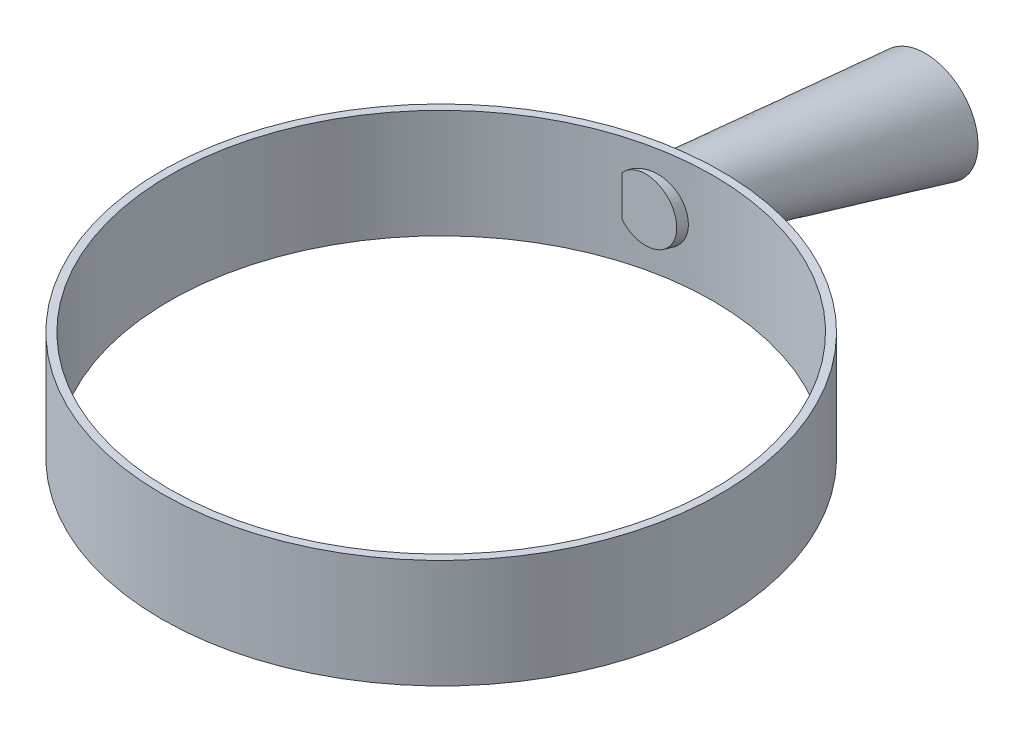
ISO-10303-21;
HEADER;
FILE_DESCRIPTION(('STEP AP214'),'2;1');
FILE_NAME('part.step','',(''),(''),'','','');
FILE_SCHEMA(('AUTOMOTIVE_DESIGN { 1 0 10303 214 1 1 1 1 }'));
ENDSEC;
DATA;
#1=APPLICATION_CONTEXT('core data for automotive mechanical design processes');
#2=APPLICATION_PROTOCOL_DEFINITION('international standard','automotive_design',2000,#1);
#3=PRODUCT_CONTEXT('',#1,'mechanical');
#4=PRODUCT('Part','Part','',(#3));
#5=PRODUCT_RELATED_PRODUCT_CATEGORY('part','',(#4));
#6=PRODUCT_DEFINITION_FORMATION('','',#4);
#7=PRODUCT_DEFINITION_CONTEXT('part definition',#1,'design');
#8=PRODUCT_DEFINITION('design','',#6,#7);
#9=PRODUCT_DEFINITION_SHAPE('','',#8);
#10=(LENGTH_UNIT() NAMED_UNIT(*) SI_UNIT(.MILLI.,.METRE.));
#11=(NAMED_UNIT(*) PLANE_ANGLE_UNIT() SI_UNIT($,.RADIAN.));
#12=(NAMED_UNIT(*) SI_UNIT($,.STERADIAN.) SOLID_ANGLE_UNIT());
#13=UNCERTAINTY_MEASURE_WITH_UNIT(LENGTH_MEASURE(1.E-05),#10,'distance_accuracy_value','');
#14=(GEOMETRIC_REPRESENTATION_CONTEXT(3) GLOBAL_UNCERTAINTY_ASSIGNED_CONTEXT((#13)) GLOBAL_UNIT_ASSIGNED_CONTEXT((#10,
#11,#12)) REPRESENTATION_CONTEXT('',''));
#15=CARTESIAN_POINT('',(0.,0.,0.));
#16=DIRECTION('',(0.,0.,1.));
#17=DIRECTION('',(1.,0.,0.));
#18=AXIS2_PLACEMENT_3D('',#15,#16,#17);
#19=CARTESIAN_POINT('',(3.57252169754929,6.99999999999999,34.7374626374517));
#20=DIRECTION('',(0.,-1.,0.));
#21=DIRECTION('',(0.,0.,-1.));
#22=AXIS2_PLACEMENT_3D('',#19,#20,#21);
#23=CYLINDRICAL_SURFACE('',#22,18.);
#24=CARTESIAN_POINT('',(-1.68130624389862,2.42674890075702,17.5212699119487));
#25=CARTESIAN_POINT('',(-1.64714885830323,2.37323130490346,17.5108460666581));
#26=CARTESIAN_POINT('',(-1.61082412494889,2.32120892872894,17.4998718462478));
#27=CARTESIAN_POINT('',(-1.53396896279211,2.2205876730403,17.4769481884529));
#28=CARTESIAN_POINT('',(-1.49343819140576,2.17198907293657,17.4649986716469));
#29=CARTESIAN_POINT('',(-1.40841455370007,2.07846941133044,17.4402885094069));
#30=CARTESIAN_POINT('',(-1.363915664429,2.03355414589842,17.4275266396534));
#31=CARTESIAN_POINT('',(-1.2714177505014,1.94770954326981,17.4014143158284));
#32=CARTESIAN_POINT('',(-1.22341864295314,1.90678030052333,17.3880638478208));
#33=CARTESIAN_POINT('',(-1.07452260671286,1.79049742615077,17.3473648983373));
#34=CARTESIAN_POINT('',(-0.968628461437852,1.72154017857043,17.3193398355642));
#35=CARTESIAN_POINT('',(-0.802210944996224,1.63289971273943,17.2770783945978));
#36=CARTESIAN_POINT('',(-0.745457329366602,1.60581281296106,17.2629496135019));
#37=CARTESIAN_POINT('',(-0.65867366229123,1.56903542455984,17.2418097170939));
#38=CARTESIAN_POINT('',(-0.629467715790664,1.55741764318894,17.2347713765564));
#39=CARTESIAN_POINT('',(-0.570545623672192,1.53553311410129,17.2207303151804));
#40=CARTESIAN_POINT('',(-0.54082944785951,1.52526644665557,17.213727596482));
#41=CARTESIAN_POINT('',(-0.452149839076636,1.49684836433202,17.1930717427487));
#42=CARTESIAN_POINT('',(-0.392541984678651,1.48060913104691,17.1794992794364));
#43=CARTESIAN_POINT('',(-0.272041676011762,1.45346353302474,17.152720845606));
#44=CARTESIAN_POINT('',(-0.211149074813771,1.4425577817337,17.1395149174108));
#45=CARTESIAN_POINT('',(-0.0885360876382672,1.42629362552735,17.1135986961763));
#46=CARTESIAN_POINT('',(-0.026815935774864,1.42093368389807,17.1008882667771));
#47=CARTESIAN_POINT('',(0.0969703841965522,1.41593902168373,17.0760774864612));
#48=CARTESIAN_POINT('',(0.159036457766588,1.41630280682861,17.0639769771428));
#49=CARTESIAN_POINT('',(0.27956489897628,1.42288678907074,17.041135644932));
#50=CARTESIAN_POINT('',(0.338037682896839,1.42878371416637,17.0303566429941));
#51=CARTESIAN_POINT('',(0.454344365341936,1.4458326180499,17.0095055754907));
#52=CARTESIAN_POINT('',(0.512178170647101,1.45698535350241,16.9994336119557));
#53=CARTESIAN_POINT('',(0.626739341035583,1.4843647187231,16.980048971343));
#54=CARTESIAN_POINT('',(0.683467078573145,1.50058960802744,16.9707360351918));
#55=CARTESIAN_POINT('',(0.795377455167991,1.53803058572239,16.9528996644549));
#56=CARTESIAN_POINT('',(0.850560193028975,1.55924635412356,16.9443761793025));
#57=CARTESIAN_POINT('',(0.956077109554433,1.60535193708865,16.9285627953396));
#58=CARTESIAN_POINT('',(1.00651404895767,1.62999235135715,16.9212317398182));
#59=CARTESIAN_POINT('',(1.10509935069146,1.68365957854962,16.9073110751165));
#60=CARTESIAN_POINT('',(1.1532481226807,1.71268560238379,16.9007213329254));
#61=CARTESIAN_POINT('',(1.24681126106863,1.77498525421269,16.8882805725098));
#62=CARTESIAN_POINT('',(1.29222591007791,1.80825844208927,16.8824294778668));
#63=CARTESIAN_POINT('',(1.38008002839797,1.87860458085108,16.8714289086351));
#64=CARTESIAN_POINT('',(1.42251900010307,1.91567816471516,16.8662795512587));
#65=CARTESIAN_POINT('',(1.5420235077123,2.02928071663711,16.8521798329568));
#66=CARTESIAN_POINT('',(1.61479581459061,2.11057755702023,16.8441208919161));
#67=CARTESIAN_POINT('',(1.71349770878025,2.240393913064,16.8336884901593));
#68=CARTESIAN_POINT('',(1.74466492780645,2.28499538135929,16.8304861689958));
#69=CARTESIAN_POINT('',(1.80321906614938,2.37666759201572,16.8246059928112));
#70=CARTESIAN_POINT('',(1.83060621798976,2.42373818224747,16.8219281055262));
#71=CARTESIAN_POINT('',(1.88212144755049,2.52142310083388,16.8169927955475));
#72=CARTESIAN_POINT('',(1.90613056346568,2.57210084451501,16.8147499865788));
#73=CARTESIAN_POINT('',(1.94988607821917,2.67526783518887,16.8107359200926));
#74=CARTESIAN_POINT('',(1.96963182613451,2.72775735738356,16.8089647345719));
#75=CARTESIAN_POINT('',(2.02235314647061,2.88744134952896,16.8043017622508));
#76=CARTESIAN_POINT('',(2.04884296834845,2.99690898712102,16.8020577771773));
#77=CARTESIAN_POINT('',(2.07527398321666,3.16432434043752,16.799839851642));
#78=CARTESIAN_POINT('',(2.08186278056905,3.22132322758641,16.7992924903098));
#79=CARTESIAN_POINT('',(2.09020516078843,3.33569812529338,16.7986008983645));
#80=CARTESIAN_POINT('',(2.09195858088284,3.39307414848175,16.7984566813226));
#81=CARTESIAN_POINT('',(2.09074059365874,3.50774967640152,16.7985573288503));
#82=CARTESIAN_POINT('',(2.08777071008301,3.56504919984406,16.7988020679424));
#83=CARTESIAN_POINT('',(2.07709975455174,3.67922736918948,16.7996884717982));
#84=CARTESIAN_POINT('',(2.0693968265188,3.73610584111556,16.8003302922792));
#85=CARTESIAN_POINT('',(2.04924710674694,3.849649597947,16.8020301689834));
#86=CARTESIAN_POINT('',(2.03674945701169,3.90630578070794,16.8030926916412));
#87=CARTESIAN_POINT('',(2.00713095228749,4.01838679455808,16.8056536937092));
#88=CARTESIAN_POINT('',(1.99000992528076,4.07381157974874,16.8071521893405));
#89=CARTESIAN_POINT('',(1.95132494278443,4.18308056801923,16.8106085061657));
#90=CARTESIAN_POINT('',(1.92976054146425,4.2369246118739,16.8125663734539));
#91=CARTESIAN_POINT('',(1.88224674392067,4.34262306670363,16.8169844396471));
#92=CARTESIAN_POINT('',(1.85629733390069,4.39447747141803,16.8194446401327));
#93=CARTESIAN_POINT('',(1.7997126123435,4.49679837157987,16.8249539040612));
#94=CARTESIAN_POINT('',(1.76899879654235,4.54722082299186,16.8280131125359));
#95=CARTESIAN_POINT('',(1.70362537947908,4.64539819240656,16.8347167939011));
#96=CARTESIAN_POINT('',(1.6689657237342,4.69315307356285,16.8383612748732));
#97=CARTESIAN_POINT('',(1.59582653345379,4.78559850204911,16.8462908646327));
#98=CARTESIAN_POINT('',(1.55734662367943,4.83028874762942,16.850576036372));
#99=CARTESIAN_POINT('',(1.47684997140539,4.91628098381675,16.8598285707323));
#100=CARTESIAN_POINT('',(1.43483318329212,4.9575829307128,16.8647959421519));
#101=CARTESIAN_POINT('',(1.34688758131266,5.03732215734274,16.8755324234918));
#102=CARTESIAN_POINT('',(1.3009028045668,5.07569600067237,16.8813141378868));
#103=CARTESIAN_POINT('',(1.2059873990508,5.14847170528105,16.8936456612186));
#104=CARTESIAN_POINT('',(1.15705679022609,5.18287359344849,16.9001954649552));
#105=CARTESIAN_POINT('',(1.0565887978769,5.24748983232681,16.9140888220268));
#106=CARTESIAN_POINT('',(1.00505059137842,5.27770284960897,16.9214326267954));
#107=CARTESIAN_POINT('',(0.899767648813964,5.33370314525893,16.9369229041325));
#108=CARTESIAN_POINT('',(0.846023800423554,5.3594921828562,16.9450690556037));
#109=CARTESIAN_POINT('',(0.735824065623823,5.40692112052856,16.9623027988182));
#110=CARTESIAN_POINT('',(0.679338362421781,5.42848710672627,16.9714034944707));
#111=CARTESIAN_POINT('',(0.564859415738477,5.46668651777688,16.9904253087499));
#112=CARTESIAN_POINT('',(0.506866157095086,5.48331989299951,17.0003464356302));
#113=CARTESIAN_POINT('',(0.389831828798211,5.51168645901409,17.0209728217183));
#114=CARTESIAN_POINT('',(0.330790850096673,5.52342007300299,17.0316780131117));
#115=CARTESIAN_POINT('',(0.212092809358189,5.54191889353352,17.0538210609087));
#116=CARTESIAN_POINT('',(0.152435699071587,5.5486837079274,17.0652589750628));
#117=CARTESIAN_POINT('',(-0.0279473463279444,5.56146925495157,17.1008071843124));
#118=CARTESIAN_POINT('',(-0.149170060241136,5.55975875401986,17.125991431408));
#119=CARTESIAN_POINT('',(-0.32880653041724,5.54093725298148,17.1652273240119));
#120=CARTESIAN_POINT('',(-0.388356370960633,5.53194319239681,17.1785581789525));
#121=CARTESIAN_POINT('',(-0.506354080890366,5.50879712547604,17.2055939769117));
#122=CARTESIAN_POINT('',(-0.564802319223292,5.49464687952667,17.2192987907803));
#123=CARTESIAN_POINT('',(-0.678889047192573,5.46170524760306,17.2466400569498));
#124=CARTESIAN_POINT('',(-0.734561163617617,5.44302535918531,17.2602711188429));
#125=CARTESIAN_POINT('',(-0.844062570659282,5.40093485832914,17.2876211899332));
#126=CARTESIAN_POINT('',(-0.897892053572942,5.37752474130781,17.3013401897746));
#127=CARTESIAN_POINT('',(-1.00326699464413,5.3260008771879,17.3286970618438));
#128=CARTESIAN_POINT('',(-1.05481292370574,5.2978881056139,17.3423349502912));
#129=CARTESIAN_POINT('',(-1.15507601371514,5.23688539017305,17.3693160101023));
#130=CARTESIAN_POINT('',(-1.20379355561727,5.20399609175394,17.3826592210052));
#131=CARTESIAN_POINT('',(-1.29628843202203,5.13501454837057,17.4083856566618));
#132=CARTESIAN_POINT('',(-1.34018119523676,5.09908308884675,17.4207861442621));
#133=CARTESIAN_POINT('',(-1.42474265531188,5.02341311322201,17.4449994534919));
#134=CARTESIAN_POINT('',(-1.46541070369258,4.98367383491154,17.4568121567428));
#135=CARTESIAN_POINT('',(-1.54321931172166,4.90068990540256,17.479686456361));
#136=CARTESIAN_POINT('',(-1.58036031148224,4.85744569280824,17.4907481463918));
#137=CARTESIAN_POINT('',(-1.6508055453298,4.76773777550706,17.5119523443931));
#138=CARTESIAN_POINT('',(-1.68411060533513,4.72127476730413,17.5220950501298));
#139=CARTESIAN_POINT('',(-1.74539367458474,4.62703905188041,17.5409290456739));
#140=CARTESIAN_POINT('',(-1.77351722375938,4.57936893673991,17.5496586834554));
#141=CARTESIAN_POINT('',(-1.82544304362026,4.48153340742196,17.5658954484764));
#142=CARTESIAN_POINT('',(-1.84924527443019,4.43136797022357,17.5734025644346));
#143=CARTESIAN_POINT('',(-1.89250180058825,4.32905165990366,17.5871264129957));
#144=CARTESIAN_POINT('',(-1.91195798293046,4.27690166000783,17.5933437055383));
#145=CARTESIAN_POINT('',(-1.94642745120453,4.17102969096096,17.6044090780259));
#146=CARTESIAN_POINT('',(-1.96144033275987,4.11730757922354,17.6092570333483));
#147=CARTESIAN_POINT('',(-1.99845494479587,3.95994913140906,17.6212451425338));
#148=CARTESIAN_POINT('',(-2.01467041461782,3.85470858418883,17.6265484750324));
#149=CARTESIAN_POINT('',(-2.02641911981274,3.69598367802394,17.6303920798481));
#150=CARTESIAN_POINT('',(-2.0282381745066,3.64291426441289,17.630987581664));
#151=CARTESIAN_POINT('',(-2.02783343560043,3.53675290088268,17.6308550690471));
#152=CARTESIAN_POINT('',(-2.0256064781445,3.48366096581183,17.6301260188558));
#153=CARTESIAN_POINT('',(-2.01263780475829,3.32170143002434,17.6258844567646));
#154=CARTESIAN_POINT('',(-1.99537602167503,3.2133153893717,17.6202417350621));
#155=CARTESIAN_POINT('',(-1.95754794631821,3.05400905255806,17.6080000525931));
#156=CARTESIAN_POINT('',(-1.94293299651594,3.00141193521884,17.6032846432082));
#157=CARTESIAN_POINT('',(-1.90992197246009,2.8975394859749,17.5926932795088));
#158=CARTESIAN_POINT('',(-1.89152700393327,2.84626377245983,17.586817664596));
#159=CARTESIAN_POINT('',(-1.84540180942308,2.73126197821691,17.5721825059902));
#160=CARTESIAN_POINT('',(-1.81649858812428,2.66804762567927,17.5630755647001));
#161=CARTESIAN_POINT('',(-1.75301610341262,2.54488466280988,17.5432849304263));
#162=CARTESIAN_POINT('',(-1.71844207492044,2.48493310782289,17.5326026925631));
#163=CARTESIAN_POINT('',(-1.68130624389862,2.42674890075702,17.5212699119487));
#164=B_SPLINE_CURVE_WITH_KNOTS('',3,(#24,#25,#26,#27,#28,#29,#30,#31,#32,#33,#34,#35,#36,#37,
#38,#39,#40,#41,#42,#43,#44,#45,#46,#47,#48,#49,#50,#51,#52,#53,#54,#55,#56,#57,#58,#59,#60,#61,
#62,#63,#64,#65,#66,#67,#68,#69,#70,#71,#72,#73,#74,#75,#76,#77,#78,#79,#80,#81,#82,#83,#84,#85,
#86,#87,#88,#89,#90,#91,#92,#93,#94,#95,#96,#97,#98,#99,#100,#101,#102,#103,#104,#105,#106,#107,
#108,#109,#110,#111,#112,#113,#114,#115,#116,#117,#118,#119,#120,#121,#122,#123,#124,#125,#126,
#127,#128,#129,#130,#131,#132,#133,#134,#135,#136,#137,#138,#139,#140,#141,#142,#143,#144,#145,
#146,#147,#148,#149,#150,#151,#152,#153,#154,#155,#156,#157,#158,#159,#160,#161,#162,#163),
.UNSPECIFIED.,.T.,.F.,(4,2,2,2,2,2,2,2,2,2,2,2,2,2,2,2,2,2,2,2,2,2,2,2,2,2,2,2,2,2,2,2,2,2,2,2,
2,2,2,2,2,2,2,2,2,2,2,2,2,2,2,2,2,2,2,2,2,2,2,2,2,2,2,2,2,2,2,2,2,4),(0.,0.192949459601889,
0.385914647387855,0.579177879032076,0.772445688998599,1.15853847866776,1.35170227386665,
1.44830036342129,1.54490418937699,1.73440900248951,1.92393560692829,2.11340968049007,
2.30283428964733,2.48183833205526,2.6608681530613,2.83983660890551,3.01879359334054,
3.18841493410777,3.35800579167097,3.52757908939696,3.69718067660885,4.0237060617345,
4.18708659909309,4.35045708192478,4.51861295406788,4.68679448180453,5.02296414097425,
5.19495252088931,5.36694669035218,5.53888538556718,5.71089155012149,5.88477502774113,
6.05866497577673,6.23257237974491,6.40648033088949,6.58363812141011,6.76079835835894,
6.93797601385942,7.11515595469288,7.29546347164812,7.47576976792836,7.65613332934691,
7.83642500070823,8.01963485697423,8.20284655657339,8.38604242873265,8.56925275752897,
8.93850646628429,9.12336931840989,9.30816911507026,9.48881412569029,9.66944022638242,
9.85002890412893,10.0305932017571,10.2045649331565,10.3785715614456,10.5525564482291,
10.7265038039212,10.8943692793278,11.0622363036873,11.2300303002221,11.3978395626835,
11.715969581005,11.87513635077,12.0344276375819,12.3624263656116,12.5266867856866,
12.6908992247159,12.900866181286,13.1106403897808),.UNSPECIFIED.);
#165=CARTESIAN_POINT('',(-1.68130624389862,2.42674890075702,17.5212699119487));
#166=VERTEX_POINT('',#165);
#167=EDGE_CURVE('E90',#166,#166,#164,.T.);
#168=ORIENTED_EDGE('',*,*,#167,.T.);
#169=EDGE_LOOP('',(#168));
#170=FACE_BOUND('',#169,.T.);
#171=CARTESIAN_POINT('',(3.57252169754929,6.99999999999999,34.7374626374517));
#172=DIRECTION('',(0.,1.,0.));
#173=DIRECTION('',(0.,0.,1.));
#174=AXIS2_PLACEMENT_3D('',#171,#172,#173);
#175=CIRCLE('',#174,18.);
#176=CARTESIAN_POINT('',(3.57252169754929,6.99999999999999,52.7374626374517));
#177=VERTEX_POINT('',#176);
#178=EDGE_CURVE('E69',#177,#177,#175,.T.);
#179=ORIENTED_EDGE('',*,*,#178,.F.);
#180=EDGE_LOOP('',(#179));
#181=FACE_BOUND('',#180,.T.);
#182=CARTESIAN_POINT('',(3.57252169754929,0.,34.7374626374517));
#183=DIRECTION('',(0.,1.,0.));
#184=DIRECTION('',(0.,0.,1.));
#185=AXIS2_PLACEMENT_3D('',#182,#183,#184);
#186=CIRCLE('',#185,18.);
#187=CARTESIAN_POINT('',(3.57252169754929,0.,52.7374626374517));
#188=VERTEX_POINT('',#187);
#189=EDGE_CURVE('E92',#188,#188,#186,.T.);
#190=ORIENTED_EDGE('',*,*,#189,.T.);
#191=EDGE_LOOP('',(#190));
#192=FACE_BOUND('',#191,.T.);
#193=ADVANCED_FACE('F47',(#170,#181,#192),#23,.T.);
#194=CARTESIAN_POINT('',(3.57252169754929,6.99999999999999,34.7374626374517));
#195=DIRECTION('',(0.,1.,0.));
#196=DIRECTION('',(0.,0.,1.));
#197=AXIS2_PLACEMENT_3D('',#194,#195,#196);
#198=PLANE('',#197);
#199=CARTESIAN_POINT('',(3.57252169754929,6.99999999999999,34.7374626374517));
#200=DIRECTION('',(0.,1.,0.));
#201=DIRECTION('',(0.,0.,1.));
#202=AXIS2_PLACEMENT_3D('',#199,#200,#201);
#203=CIRCLE('',#202,17.5);
#204=CARTESIAN_POINT('',(3.57252169754929,6.99999999999999,52.2374626374517));
#205=VERTEX_POINT('',#204);
#206=EDGE_CURVE('E85',#205,#205,#203,.T.);
#207=ORIENTED_EDGE('',*,*,#206,.F.);
#208=EDGE_LOOP('',(#207));
#209=FACE_BOUND('',#208,.T.);
#210=ORIENTED_EDGE('',*,*,#178,.T.);
#211=EDGE_LOOP('',(#210));
#212=FACE_BOUND('',#211,.T.);
#213=ADVANCED_FACE('F170',(#209,#212),#198,.T.);
#214=CARTESIAN_POINT('',(3.57252169754929,0.,34.7374626374517));
#215=DIRECTION('',(0.,1.,0.));
#216=DIRECTION('',(0.,0.,1.));
#217=AXIS2_PLACEMENT_3D('',#214,#215,#216);
#218=PLANE('',#217);
#219=CARTESIAN_POINT('',(3.57252169754929,0.,34.7374626374517));
#220=DIRECTION('',(0.,-1.,0.));
#221=DIRECTION('',(0.,0.,-1.));
#222=AXIS2_PLACEMENT_3D('',#219,#220,#221);
#223=CIRCLE('',#222,17.5);
#224=CARTESIAN_POINT('',(3.57252169754929,0.,17.2374626374517));
#225=VERTEX_POINT('',#224);
#226=EDGE_CURVE('E88',#225,#225,#223,.T.);
#227=ORIENTED_EDGE('',*,*,#226,.F.);
#228=EDGE_LOOP('',(#227));
#229=FACE_BOUND('',#228,.T.);
#230=ORIENTED_EDGE('',*,*,#189,.F.);
#231=EDGE_LOOP('',(#230));
#232=FACE_BOUND('',#231,.T.);
#233=ADVANCED_FACE('F80',(#229,#232),#218,.F.);
#234=CARTESIAN_POINT('',(3.57252169754929,17.,34.7374626374517));
#235=DIRECTION('',(0.,-1.,0.));
#236=DIRECTION('',(0.,0.,-1.));
#237=AXIS2_PLACEMENT_3D('',#234,#235,#236);
#238=CYLINDRICAL_SURFACE('',#237,17.5);
#239=CARTESIAN_POINT('',(-1.53701296422848,4.95175351119825,18.));
#240=CARTESIAN_POINT('',(-1.50153502644045,4.99342665133516,17.9891689839598));
#241=CARTESIAN_POINT('',(-1.46433121425551,5.03352559656854,17.977935283513));
#242=CARTESIAN_POINT('',(-1.38672198991224,5.11029270737214,17.9548068064542));
#243=CARTESIAN_POINT('',(-1.34631636358678,5.14696064308613,17.9429119856363));
#244=CARTESIAN_POINT('',(-1.26268111558752,5.21647575600409,17.9186426366942));
#245=CARTESIAN_POINT('',(-1.21946011017455,5.249333807439,17.9062696153444));
#246=CARTESIAN_POINT('',(-1.13031871891712,5.31097780366795,17.8811453485749));
#247=CARTESIAN_POINT('',(-1.0843987399676,5.33976436005943,17.8683941603102));
#248=CARTESIAN_POINT('',(-0.990332277925075,5.39318317284197,17.8427078746898));
#249=CARTESIAN_POINT('',(-0.942188339703415,5.41782003467456,17.8297729987222));
#250=CARTESIAN_POINT('',(-0.844028317996039,5.4630237351677,17.8038669301575));
#251=CARTESIAN_POINT('',(-0.794011860080122,5.48358975459516,17.790895730782));
#252=CARTESIAN_POINT('',(-0.692431385387396,5.52063513963843,17.7650460927486));
#253=CARTESIAN_POINT('',(-0.640866490952668,5.53711213663255,17.7521677120311));
#254=CARTESIAN_POINT('',(-0.536541866172644,5.5659000669202,17.7266284180388));
#255=CARTESIAN_POINT('',(-0.48378227022058,5.57821146634666,17.7139674805826));
#256=CARTESIAN_POINT('',(-0.374328409722634,5.59912090279515,17.6882482692312));
#257=CARTESIAN_POINT('',(-0.317581239113693,5.60746739135196,17.6752084594643));
#258=CARTESIAN_POINT('',(-0.20346815198762,5.61911559426997,17.6495920514792));
#259=CARTESIAN_POINT('',(-0.146102202933554,5.62241704203507,17.6370154777742));
#260=CARTESIAN_POINT('',(-0.0311759434767913,5.62418040564215,17.6124279562121));
#261=CARTESIAN_POINT('',(0.0263843616939886,5.62264245073587,17.6004169932572));
#262=CARTESIAN_POINT('',(0.141291621661019,5.61480173662587,17.5770398035803));
#263=CARTESIAN_POINT('',(0.198638557938321,5.60849857310193,17.5656736316558));
#264=CARTESIAN_POINT('',(0.370946646917059,5.58242711692876,17.5324169439395));
#265=CARTESIAN_POINT('',(0.48516050208567,5.55548378028541,17.511584976263));
#266=CARTESIAN_POINT('',(0.652096933436513,5.5009484965445,17.4827718245402));
#267=CARTESIAN_POINT('',(0.707033033513427,5.48040551103294,17.4735700094738));
#268=CARTESIAN_POINT('',(0.815158173184163,5.43480881780919,17.4559715902325));
#269=CARTESIAN_POINT('',(0.868347121403549,5.40975487462078,17.4475750281277));
#270=CARTESIAN_POINT('',(0.973479215866983,5.35478021254759,17.4314561278525));
#271=CARTESIAN_POINT('',(1.02538350317421,5.32478101704462,17.4237483989096));
#272=CARTESIAN_POINT('',(1.12656665292769,5.26045820203752,17.4091645223863));
#273=CARTESIAN_POINT('',(1.17584542249936,5.22613442970092,17.4022884042123));
#274=CARTESIAN_POINT('',(1.27140506723224,5.15339922263624,17.3893449015231));
#275=CARTESIAN_POINT('',(1.31768572743686,5.11498749533316,17.3832775749633));
#276=CARTESIAN_POINT('',(1.4069131741757,5.03436804334384,17.3719174232846));
#277=CARTESIAN_POINT('',(1.44986021192352,4.99216060521145,17.3666245397789));
#278=CARTESIAN_POINT('',(1.53164855467611,4.90450201941141,17.3568262415996));
#279=CARTESIAN_POINT('',(1.57052060031465,4.85908026351775,17.3523147335292));
#280=CARTESIAN_POINT('',(1.6442830742315,4.76505223419808,17.3439789446348));
#281=CARTESIAN_POINT('',(1.67917321044634,4.71644572758934,17.3401547142092));
#282=CARTESIAN_POINT('',(1.74479726093446,4.6164624498925,17.3331381809238));
#283=CARTESIAN_POINT('',(1.77553143242497,4.56508585052404,17.3299458389502));
#284=CARTESIAN_POINT('',(1.83242955340899,4.45982984544839,17.3241660042741));
#285=CARTESIAN_POINT('',(1.85859393732016,4.40595067825991,17.3215784540705));
#286=CARTESIAN_POINT('',(1.90569238509967,4.29716935006733,17.3170082961106));
#287=CARTESIAN_POINT('',(1.92671777187905,4.24230709330341,17.3150149619971));
#288=CARTESIAN_POINT('',(1.96410496368317,4.1309986618195,17.3115237231266));
#289=CARTESIAN_POINT('',(1.98046653930682,4.07455240933673,17.3100258427391));
#290=CARTESIAN_POINT('',(2.0083181389311,3.96045494315283,17.3075037906087));
#291=CARTESIAN_POINT('',(2.0198084442427,3.90280379923479,17.3064795915109));
#292=CARTESIAN_POINT('',(2.03780466774715,3.78674828165502,17.3048862803413));
#293=CARTESIAN_POINT('',(2.04431074224387,3.728343931672,17.3043171539988));
#294=CARTESIAN_POINT('',(2.05612500491744,3.55416402113645,17.3032820213243));
#295=CARTESIAN_POINT('',(2.05413337968024,3.43775704848366,17.3034529561172));
#296=CARTESIAN_POINT('',(2.03614353549111,3.26491055657633,17.3050344502488));
#297=CARTESIAN_POINT('',(2.02763827111792,3.20755998298179,17.3057831908938));
#298=CARTESIAN_POINT('',(2.00580317075822,3.09379730469184,17.3077317097702));
#299=CARTESIAN_POINT('',(1.99247539956463,3.03738480914701,17.3089312949775));
#300=CARTESIAN_POINT('',(1.96132905479054,2.92689915704265,17.3117834139792));
#301=CARTESIAN_POINT('',(1.94359344436421,2.87280231704792,17.3134276245994));
#302=CARTESIAN_POINT('',(1.90359446808634,2.76633206188147,17.3172133382559));
#303=CARTESIAN_POINT('',(1.88133173693005,2.7139584063165,17.3193547715883));
#304=CARTESIAN_POINT('',(1.83234165781146,2.61135439207036,17.3241809255101));
#305=CARTESIAN_POINT('',(1.80561373998109,2.56112430799041,17.3268657154544));
#306=CARTESIAN_POINT('',(1.74777730888777,2.4632896193861,17.332832525));
#307=CARTESIAN_POINT('',(1.71666868286036,2.41568508249024,17.3361145599757));
#308=CARTESIAN_POINT('',(1.65157718757039,2.3248348347648,17.3431816576253));
#309=CARTESIAN_POINT('',(1.61771859673533,2.28149826835384,17.346947197044));
#310=CARTESIAN_POINT('',(1.5465730935814,2.19779107140663,17.3550918607632));
#311=CARTESIAN_POINT('',(1.50928591678931,2.1574206701064,17.3594710324116));
#312=CARTESIAN_POINT('',(1.43154449121838,2.07996280184749,17.368877531113));
#313=CARTESIAN_POINT('',(1.39109134989119,2.04287419650634,17.3739046319154));
#314=CARTESIAN_POINT('',(1.30725191901662,1.97229545730366,17.3846432687746));
#315=CARTESIAN_POINT('',(1.26386617195371,1.93880466085766,17.3903546783954));
#316=CARTESIAN_POINT('',(1.17435703245503,1.8758221251874,17.4025025542049));
#317=CARTESIAN_POINT('',(1.12823322472939,1.84633099484402,17.4089391305153));
#318=CARTESIAN_POINT('',(1.03365573705458,1.79159319560649,17.4225427257498));
#319=CARTESIAN_POINT('',(0.985201810862873,1.76634697657981,17.4297098219638));
#320=CARTESIAN_POINT('',(0.836996650033497,1.6969651036072,17.4523007135384));
#321=CARTESIAN_POINT('',(0.7343397780681,1.65914308241068,17.4688224058396));
#322=CARTESIAN_POINT('',(0.578270057538655,1.61585471839914,17.4954440027915));
#323=CARTESIAN_POINT('',(0.526402237334347,1.6037198381259,17.504529546148));
#324=CARTESIAN_POINT('',(0.421943896793011,1.58373427068747,17.5233212076932));
#325=CARTESIAN_POINT('',(0.369353505290923,1.57588282968923,17.5330272163514));
#326=CARTESIAN_POINT('',(0.263818529712404,1.56468738456564,17.5530113160363));
#327=CARTESIAN_POINT('',(0.210874038767152,1.56134223873782,17.5632892614712));
#328=CARTESIAN_POINT('',(0.104998200979326,1.55903965106703,17.5843520933088));
#329=CARTESIAN_POINT('',(0.0520668567973784,1.56008278896071,17.5951370465062));
#330=CARTESIAN_POINT('',(-0.109088761771805,1.56973558999044,17.6287527056086));
#331=CARTESIAN_POINT('',(-0.216815921464685,1.58515901191339,17.6523034737337));
#332=CARTESIAN_POINT('',(-0.42827200947336,1.63274033526699,17.70057828177));
#333=CARTESIAN_POINT('',(-0.531998578465639,1.66490795416956,17.7253029953985));
#334=CARTESIAN_POINT('',(-0.686335287861645,1.72656539300943,17.7635048324791));
#335=CARTESIAN_POINT('',(-0.739293392960327,1.7503934981506,17.7768868875606));
#336=CARTESIAN_POINT('',(-0.84309077616215,1.80234233263864,17.8036139474708));
#337=CARTESIAN_POINT('',(-0.893929749109009,1.83046367751468,17.8169589467071));
#338=CARTESIAN_POINT('',(-0.993143326298266,1.8907977421927,17.8434594995973));
#339=CARTESIAN_POINT('',(-1.0415186563308,1.92300924714842,17.8566151082169));
#340=CARTESIAN_POINT('',(-1.13556087949751,1.9912708973032,17.8826017250076));
#341=CARTESIAN_POINT('',(-1.18122837757437,2.02732018005529,17.8954328053097));
#342=CARTESIAN_POINT('',(-1.25406869256965,2.08970867935134,17.9161988741604));
#343=CARTESIAN_POINT('',(-1.28210087076011,2.11500793657427,17.9242697734538));
#344=CARTESIAN_POINT('',(-1.33686499037321,2.16703536977008,17.940179110215));
#345=CARTESIAN_POINT('',(-1.36359720330078,2.19376324489908,17.948017596089));
#346=CARTESIAN_POINT('',(-1.44161876622835,2.27592130579918,17.9710873805959));
#347=CARTESIAN_POINT('',(-1.49085347267477,2.33342898668168,17.9859075161126));
#348=CARTESIAN_POINT('',(-1.53701296422848,2.39354749130152,18.));
#349=B_SPLINE_CURVE_WITH_KNOTS('',3,(#239,#240,#241,#242,#243,#244,#245,#246,#247,#248,#249,
#250,#251,#252,#253,#254,#255,#256,#257,#258,#259,#260,#261,#262,#263,#264,#265,#266,#267,#268,
#269,#270,#271,#272,#273,#274,#275,#276,#277,#278,#279,#280,#281,#282,#283,#284,#285,#286,#287,
#288,#289,#290,#291,#292,#293,#294,#295,#296,#297,#298,#299,#300,#301,#302,#303,#304,#305,#306,
#307,#308,#309,#310,#311,#312,#313,#314,#315,#316,#317,#318,#319,#320,#321,#322,#323,#324,#325,
#326,#327,#328,#329,#330,#331,#332,#333,#334,#335,#336,#337,#338,#339,#340,#341,#342,#343,#344,
#345,#346,#347,#348),.UNSPECIFIED.,.F.,.F.,(4,2,2,2,2,2,2,2,2,2,2,2,2,2,2,2,2,2,2,2,2,2,2,2,2,2,
2,2,2,2,2,2,2,2,2,2,2,2,2,2,2,2,2,2,2,2,2,2,2,2,2,2,2,2,4),(0.,0.167322649943499,
0.334656501446298,0.501500333955722,0.668319077429773,0.834951443372289,1.00161730908144,
1.16837949407865,1.33512301210889,1.51136723046049,1.6876207617985,1.86386958576207,
2.04013336583108,2.39573993723148,2.57368734010761,2.75164403469978,2.93275878536394,
3.11387993849963,3.29501406320713,3.47613452481362,3.65577185459069,3.83542235187726,
4.01506172530324,4.19468401236809,4.37083432333384,4.54699329719385,4.7231420966636,
4.89928537193734,5.24649524309157,5.4202792095352,5.59398885692766,5.76464833813174,
5.93528390961879,6.10594127507757,6.27660303425592,6.44178793203754,6.60698558250847,
6.77212570306813,6.93723535854732,7.10237012100613,7.26752237311075,7.59760112869832,
7.75958745917141,7.92154527282338,8.08346204557017,8.2454002098315,8.57794517141013,
8.91068334053071,9.0892926229914,9.26792753706265,9.44650951713029,9.62505144963052,
9.74084642917303,9.85661711950072,10.087674308613),.UNSPECIFIED.);
#350=CARTESIAN_POINT('',(-1.5370130912736,4.95257404532555,18.));
#351=VERTEX_POINT('',#350);
#352=CARTESIAN_POINT('',(-1.53701295651375,2.39349054549986,18.));
#353=VERTEX_POINT('',#352);
#354=EDGE_CURVE('E57',#351,#353,#349,.T.);
#355=ORIENTED_EDGE('',*,*,#354,.T.);
#356=DIRECTION('',(0.,-1.,0.));
#357=VECTOR('',#356,1.);
#358=CARTESIAN_POINT('',(-1.53701296422847,17.,18.));
#359=LINE('',#358,#357);
#360=EDGE_CURVE('E12',#353,#351,#359,.F.);
#361=ORIENTED_EDGE('',*,*,#360,.T.);
#362=EDGE_LOOP('',(#355,#361));
#363=FACE_BOUND('',#362,.T.);
#364=ORIENTED_EDGE('',*,*,#206,.T.);
#365=EDGE_LOOP('',(#364));
#366=FACE_BOUND('',#365,.T.);
#367=ORIENTED_EDGE('',*,*,#226,.T.);
#368=EDGE_LOOP('',(#367));
#369=FACE_BOUND('',#368,.T.);
#370=ADVANCED_FACE('F77',(#363,#366,#369),#238,.F.);
#371=CARTESIAN_POINT('',(-1.64420859163813,2.53470814963623,18.));
#372=CARTESIAN_POINT('',(-3.0390608421143,-1.52450293470611,0.));
#373=CARTESIAN_POINT('',(-1.739098078059,2.67172553227274,18.));
#374=CARTESIAN_POINT('',(-3.16610275333981,-1.27124786452992,0.));
#375=CARTESIAN_POINT('',(-1.8297757513697,2.83825815705994,18.));
#376=CARTESIAN_POINT('',(-3.27901674678468,-0.969317432741587,0.));
#377=CARTESIAN_POINT('',(-1.9647620933238,3.24300886049392,18.));
#378=CARTESIAN_POINT('',(-3.4097017135102,-0.255854130310134,0.));
#379=CARTESIAN_POINT('',(-2.00864932025314,3.48249191529044,18.));
#380=CARTESIAN_POINT('',(-3.42646165551559,0.157707432901679,0.));
#381=CARTESIAN_POINT('',(-1.99353210318465,3.8822061503986,18.));
#382=CARTESIAN_POINT('',(-3.30569482401485,0.826897519804699,0.));
#383=CARTESIAN_POINT('',(-1.97438310865278,4.02229764428088,18.));
#384=CARTESIAN_POINT('',(-3.24093330256126,1.05738110241765,0.));
#385=CARTESIAN_POINT('',(-1.90272521360294,4.30560502143944,18.));
#386=CARTESIAN_POINT('',(-3.05283606265305,1.517199868826,0.));
#387=CARTESIAN_POINT('',(-1.85021631308498,4.44882090471571,18.));
#388=CARTESIAN_POINT('',(-2.92934385841876,1.74644085793232,0.));
#389=CARTESIAN_POINT('',(-1.7066985444283,4.72779461903048,18.));
#390=CARTESIAN_POINT('',(-2.62124799540547,2.18178139548716,0.));
#391=CARTESIAN_POINT('',(-1.61526133782003,4.86267057993299,18.));
#392=CARTESIAN_POINT('',(-2.43656717615997,2.38766980318154,0.));
#393=CARTESIAN_POINT('',(-1.3997576754494,5.11012381636975,18.));
#394=CARTESIAN_POINT('',(-2.01477615800353,2.75290823060009,0.));
#395=CARTESIAN_POINT('',(-1.27569121968704,5.22270109190401,18.));
#396=CARTESIAN_POINT('',(-1.7777580048823,2.91201893088879,0.));
#397=CARTESIAN_POINT('',(-1.00165645441402,5.41248006474577,18.));
#398=CARTESIAN_POINT('',(-1.27124786452992,3.16610275333981,0.));
#399=CARTESIAN_POINT('',(-0.852636362084233,5.48902508740675,18.));
#400=CARTESIAN_POINT('',(-1.00199564541254,3.26095559913647,0.));
#401=CARTESIAN_POINT('',(-0.545198249202024,5.60372791852095,18.));
#402=CARTESIAN_POINT('',(-0.457041628823034,3.3806714780481,0.));
#403=CARTESIAN_POINT('',(-0.386780228649601,5.64188572697416,18.));
#404=CARTESIAN_POINT('',(-0.18158669654555,3.40560382057995,0.));
#405=CARTESIAN_POINT('',(-0.0751537504860395,5.67811584298479,18.));
#406=CARTESIAN_POINT('',(0.351579957289405,3.39227101581573,0.));
#407=CARTESIAN_POINT('',(0.0773798321885172,5.67689928527011,18.));
#408=CARTESIAN_POINT('',(0.60916857001661,3.35419395991116,0.));
#409=CARTESIAN_POINT('',(0.367789185484185,5.64433655513542,18.));
#410=CARTESIAN_POINT('',(1.09020838923408,3.230038565628,0.));
#411=CARTESIAN_POINT('',(0.505664956105295,5.61299038271541,18.));
#412=CARTESIAN_POINT('',(1.31367765599887,3.14414198055798,0.));
#413=CARTESIAN_POINT('',(0.885157801029955,5.48655786849937,18.));
#414=CARTESIAN_POINT('',(1.92228542660557,2.84083259798443,0.));
#415=CARTESIAN_POINT('',(1.09390434274755,5.36124584376445,18.));
#416=CARTESIAN_POINT('',(2.24376186904696,2.58012786235915,0.));
#417=CARTESIAN_POINT('',(1.42531880444935,5.09252870806345,18.));
#418=CARTESIAN_POINT('',(2.73751330437707,2.04879184386059,0.));
#419=CARTESIAN_POINT('',(1.54931910521725,4.9490732063738,18.));
#420=CARTESIAN_POINT('',(2.91201893088879,1.7777580048823,0.));
#421=CARTESIAN_POINT('',(1.739098078059,4.67503844110078,18.));
#422=CARTESIAN_POINT('',(3.16610275333981,1.27124786452992,0.));
#423=CARTESIAN_POINT('',(1.8297757513697,4.50850581631358,18.));
#424=CARTESIAN_POINT('',(3.27901674678468,0.969317432741587,0.));
#425=CARTESIAN_POINT('',(1.9647620933238,4.10375511287961,18.));
#426=CARTESIAN_POINT('',(3.40970171351019,0.255854130310134,0.));
#427=CARTESIAN_POINT('',(2.00864932025314,3.86427205808309,18.));
#428=CARTESIAN_POINT('',(3.4264616555156,-0.157707432901678,0.));
#429=CARTESIAN_POINT('',(1.99353210318465,3.46455782297492,18.));
#430=CARTESIAN_POINT('',(3.30569482401486,-0.826897519804699,0.));
#431=CARTESIAN_POINT('',(1.97438310865278,3.32446632909265,18.));
#432=CARTESIAN_POINT('',(3.24093330256126,-1.05738110241765,0.));
#433=CARTESIAN_POINT('',(1.90272521360294,3.04115895193409,18.));
#434=CARTESIAN_POINT('',(3.05283606265305,-1.517199868826,0.));
#435=CARTESIAN_POINT('',(1.85021631308498,2.89794306865782,18.));
#436=CARTESIAN_POINT('',(2.92934385841876,-1.74644085793232,0.));
#437=CARTESIAN_POINT('',(1.7066985444283,2.61896935434305,18.));
#438=CARTESIAN_POINT('',(2.62124799540547,-2.18178139548716,0.));
#439=CARTESIAN_POINT('',(1.61526133782003,2.48409339344054,18.));
#440=CARTESIAN_POINT('',(2.43656717615997,-2.38766980318154,0.));
#441=CARTESIAN_POINT('',(1.3997576754494,2.23664015700377,18.));
#442=CARTESIAN_POINT('',(2.01477615800352,-2.75290823060009,0.));
#443=CARTESIAN_POINT('',(1.27569121968704,2.12406288146951,18.));
#444=CARTESIAN_POINT('',(1.7777580048823,-2.91201893088879,0.));
#445=CARTESIAN_POINT('',(1.00165645441402,1.93428390862776,18.));
#446=CARTESIAN_POINT('',(1.27124786452992,-3.16610275333981,0.));
#447=CARTESIAN_POINT('',(0.852636362084231,1.85773888596677,18.));
#448=CARTESIAN_POINT('',(1.00199564541254,-3.26095559913646,0.));
#449=CARTESIAN_POINT('',(0.545198249202023,1.74303605485258,18.));
#450=CARTESIAN_POINT('',(0.457041628823034,-3.3806714780481,0.));
#451=CARTESIAN_POINT('',(0.386780228649601,1.70487824639937,18.));
#452=CARTESIAN_POINT('',(0.181586696545551,-3.40560382057995,0.));
#453=CARTESIAN_POINT('',(0.0751537504860379,1.66864813038873,18.));
#454=CARTESIAN_POINT('',(-0.351579957289405,-3.39227101581573,0.));
#455=CARTESIAN_POINT('',(-0.0773798321885195,1.66986468810341,18.));
#456=CARTESIAN_POINT('',(-0.60916857001661,-3.35419395991116,0.));
#457=CARTESIAN_POINT('',(-0.367789185484187,1.70242741823811,18.));
#458=CARTESIAN_POINT('',(-1.09020838923408,-3.230038565628,0.));
#459=CARTESIAN_POINT('',(-0.505664956105297,1.73377359065812,18.));
#460=CARTESIAN_POINT('',(-1.31367765599888,-3.14414198055798,0.));
#461=CARTESIAN_POINT('',(-0.885157801029956,1.86020610487416,18.));
#462=CARTESIAN_POINT('',(-1.92228542660557,-2.84083259798443,0.));
#463=CARTESIAN_POINT('',(-1.09390434274755,1.98551812960908,18.));
#464=CARTESIAN_POINT('',(-2.24376186904696,-2.58012786235915,0.));
#465=CARTESIAN_POINT('',(-1.42531880444935,2.25423526531008,18.));
#466=CARTESIAN_POINT('',(-2.73751330437707,-2.04879184386059,0.));
#467=CARTESIAN_POINT('',(-1.54931910521725,2.39769076699972,18.));
#468=CARTESIAN_POINT('',(-2.91201893088879,-1.7777580048823,0.));
#469=CARTESIAN_POINT('',(-1.64420859163813,2.53470814963623,18.));
#470=CARTESIAN_POINT('',(-3.0390608421143,-1.52450293470611,0.));
#471=B_SPLINE_SURFACE_WITH_KNOTS('',3,1,((#371,#372),(#373,#374),(#375,#376),(#377,#378),(#379,
#380),(#381,#382),(#383,#384),(#385,#386),(#387,#388),(#389,#390),(#391,#392),(#393,#394),(#395,
#396),(#397,#398),(#399,#400),(#401,#402),(#403,#404),(#405,#406),(#407,#408),(#409,#410),(#411,
#412),(#413,#414),(#415,#416),(#417,#418),(#419,#420),(#421,#422),(#423,#424),(#425,#426),(#427,
#428),(#429,#430),(#431,#432),(#433,#434),(#435,#436),(#437,#438),(#439,#440),(#441,#442),(#443,
#444),(#445,#446),(#447,#448),(#449,#450),(#451,#452),(#453,#454),(#455,#456),(#457,#458),(#459,
#460),(#461,#462),(#463,#464),(#465,#466),(#467,#468),(#469,#470)),.UNSPECIFIED.,.T.,.F.,.F.,(4,
2,2,2,2,2,2,2,2,2,2,2,2,2,2,2,2,2,2,2,2,2,2,2,4),(2,2),(0.,0.0625,0.125,0.15625,0.1875,0.21875,
0.25,0.28125,0.3125,0.34375,0.375,0.4375,0.5,0.5625,0.625,0.65625,0.6875,0.71875,0.75,0.78125,
0.8125,0.84375,0.875,0.9375,1.),(0.,1.),.UNSPECIFIED.);
#472=CARTESIAN_POINT('',(0.,3.67338198668676,18.));
#473=DIRECTION('',(0.,0.,1.));
#474=DIRECTION('',(1.,0.,0.));
#475=AXIS2_PLACEMENT_3D('',#472,#473,#474);
#476=CIRCLE('',#475,2.);
#477=EDGE_CURVE('E51',#353,#351,#476,.T.);
#478=ORIENTED_EDGE('',*,*,#354,.F.);
#479=ORIENTED_EDGE('',*,*,#477,.F.);
#480=EDGE_LOOP('',(#478,#479));
#481=FACE_BOUND('',#480,.T.);
#482=ADVANCED_FACE('F67',(#481),#471,.T.);
#483=CARTESIAN_POINT('',(0.,3.67338198668676,18.));
#484=DIRECTION('',(0.,0.,1.));
#485=DIRECTION('',(1.,0.,0.));
#486=AXIS2_PLACEMENT_3D('',#483,#484,#485);
#487=PLANE('',#486);
#488=ORIENTED_EDGE('',*,*,#360,.F.);
#489=ORIENTED_EDGE('',*,*,#477,.T.);
#490=EDGE_LOOP('',(#488,#489));
#491=FACE_BOUND('',#490,.T.);
#492=ADVANCED_FACE('F73',(#491),#487,.T.);
#493=CARTESIAN_POINT('',(0.,0.,0.));
#494=DIRECTION('',(0.,0.,1.));
#495=DIRECTION('',(1.,0.,0.));
#496=AXIS2_PLACEMENT_3D('',#493,#494,#495);
#497=CIRCLE('',#496,3.4);
#498=CARTESIAN_POINT('',(-3.0390608421143,-1.52450293470611,0.));
#499=VERTEX_POINT('',#498);
#500=EDGE_CURVE('E74',#499,#499,#497,.T.);
#501=CARTESIAN_POINT('',(-3.0390608421143,-1.52450293470611,0.));
#502=CARTESIAN_POINT('',(-3.02491756504955,-1.48334406142003,0.182513228249466));
#503=CARTESIAN_POINT('',(-3.0107742879848,-1.44218518813396,0.365026456498932));
#504=CARTESIAN_POINT('',(-2.98248773385531,-1.35986744156181,0.730052912997864));
#505=CARTESIAN_POINT('',(-2.96834445679057,-1.31870856827574,0.91256614124733));
#506=CARTESIAN_POINT('',(-2.94005790266107,-1.23639082170359,1.27759259774626));
#507=CARTESIAN_POINT('',(-2.92591462559632,-1.19523194841751,1.46010582599573));
#508=CARTESIAN_POINT('',(-2.89762807146683,-1.11291420184537,1.82513228249466));
#509=CARTESIAN_POINT('',(-2.88348479440209,-1.07175532855929,2.00764551074413));
#510=CARTESIAN_POINT('',(-2.85519824027259,-0.989437581987142,2.37267196724306));
#511=CARTESIAN_POINT('',(-2.84105496320785,-0.948278708701068,2.55518519549252));
#512=CARTESIAN_POINT('',(-2.81276840907835,-0.86596096212892,2.92021165199146));
#513=CARTESIAN_POINT('',(-2.79862513201361,-0.824802088842846,3.10272488024092));
#514=CARTESIAN_POINT('',(-2.77033857788411,-0.742484342270697,3.46775133673986));
#515=CARTESIAN_POINT('',(-2.75619530081937,-0.701325468984623,3.65026456498932));
#516=CARTESIAN_POINT('',(-2.72790874668987,-0.619007722412474,4.01529102148825));
#517=CARTESIAN_POINT('',(-2.71376546962513,-0.5778488491264,4.19780424973772));
#518=CARTESIAN_POINT('',(-2.68547891549563,-0.495531102554252,4.56283070623665));
#519=CARTESIAN_POINT('',(-2.67133563843089,-0.454372229268177,4.74534393448612));
#520=CARTESIAN_POINT('',(-2.64304908430139,-0.372054482696029,5.11037039098505));
#521=CARTESIAN_POINT('',(-2.62890580723665,-0.330895609409955,5.29288361923452));
#522=CARTESIAN_POINT('',(-2.60061925310715,-0.248577862837806,5.65791007573345));
#523=CARTESIAN_POINT('',(-2.58647597604241,-0.207418989551732,5.84042330398291));
#524=CARTESIAN_POINT('',(-2.55818942191291,-0.125101242979583,6.20544976048185));
#525=CARTESIAN_POINT('',(-2.54404614484817,-0.0839423696935091,6.38796298873131));
#526=CARTESIAN_POINT('',(-2.51575959071867,-0.00162462312136082,6.75298944523024));
#527=CARTESIAN_POINT('',(-2.50161631365393,0.0395342501647134,6.93550267347971));
#528=CARTESIAN_POINT('',(-2.47332975952443,0.121851996736862,7.30052912997864));
#529=CARTESIAN_POINT('',(-2.45918648245969,0.163010870022936,7.48304235822811));
#530=CARTESIAN_POINT('',(-2.43089992833019,0.245328616595085,7.84806881472704));
#531=CARTESIAN_POINT('',(-2.41675665126545,0.286487489881159,8.03058204297651));
#532=CARTESIAN_POINT('',(-2.38847009713595,0.368805236453308,8.39560849947544));
#533=CARTESIAN_POINT('',(-2.37432682007121,0.409964109739382,8.57812172772491));
#534=CARTESIAN_POINT('',(-2.34604026594171,0.49228185631153,8.94314818422384));
#535=CARTESIAN_POINT('',(-2.33189698887697,0.533440729597604,9.1256614124733));
#536=CARTESIAN_POINT('',(-2.30361043474747,0.615758476169753,9.49068786897224));
#537=CARTESIAN_POINT('',(-2.28946715768273,0.656917349455827,9.6732010972217));
#538=CARTESIAN_POINT('',(-2.26118060355323,0.739235096027976,10.0382275537206));
#539=CARTESIAN_POINT('',(-2.24703732648849,0.78039396931405,10.2207407819701));
#540=CARTESIAN_POINT('',(-2.21875077235899,0.862711715886199,10.585767238469));
#541=CARTESIAN_POINT('',(-2.20460749529425,0.903870589172273,10.7682804667185));
#542=CARTESIAN_POINT('',(-2.17632094116475,0.986188335744421,11.1333069232174));
#543=CARTESIAN_POINT('',(-2.16217766410001,1.0273472090305,11.3158201514669));
#544=CARTESIAN_POINT('',(-2.13389110997051,1.10966495560264,11.6808466079658));
#545=CARTESIAN_POINT('',(-2.11974783290577,1.15082382888872,11.8633598362153));
#546=CARTESIAN_POINT('',(-2.09146127877627,1.23314157546087,12.2283862927142));
#547=CARTESIAN_POINT('',(-2.07731800171153,1.27430044874694,12.4108995209637));
#548=CARTESIAN_POINT('',(-2.04903144758203,1.35661819531909,12.7759259774626));
#549=CARTESIAN_POINT('',(-2.03488817051729,1.39777706860516,12.9584392057121));
#550=CARTESIAN_POINT('',(-2.0066016163878,1.48009481517731,13.323465662211));
#551=CARTESIAN_POINT('',(-1.99245833932305,1.52125368846339,13.5059788904605));
#552=CARTESIAN_POINT('',(-1.96417178519356,1.60357143503553,13.8710053469594));
#553=CARTESIAN_POINT('',(-1.95002850812881,1.64473030832161,14.0535185752089));
#554=CARTESIAN_POINT('',(-1.92174195399932,1.72704805489376,14.4185450317078));
#555=CARTESIAN_POINT('',(-1.90759867693457,1.76820692817983,14.6010582599573));
#556=CARTESIAN_POINT('',(-1.87931212280508,1.85052467475198,14.9660847164562));
#557=CARTESIAN_POINT('',(-1.86516884574033,1.89168354803805,15.1485979447057));
#558=CARTESIAN_POINT('',(-1.83688229161084,1.9740012946102,15.5136244012046));
#559=CARTESIAN_POINT('',(-1.82273901454609,2.01516016789628,15.6961376294541));
#560=CARTESIAN_POINT('',(-1.7944524604166,2.09747791446843,16.061164085953));
#561=CARTESIAN_POINT('',(-1.78030918335185,2.1386367877545,16.2436773142025));
#562=CARTESIAN_POINT('',(-1.75202262922236,2.22095453432665,16.6087037707014));
#563=CARTESIAN_POINT('',(-1.73787935215761,2.26211340761272,16.7912169989509));
#564=CARTESIAN_POINT('',(-1.70959279802812,2.34443115418487,17.1562434554498));
#565=CARTESIAN_POINT('',(-1.69544952096337,2.38559002747094,17.3387566836993));
#566=CARTESIAN_POINT('',(-1.68130624389862,2.42674890075702,17.5212699119487));
#567=B_SPLINE_CURVE_WITH_KNOTS('',3,(#501,#502,#503,#504,#505,#506,#507,#508,#509,#510,#511,
#512,#513,#514,#515,#516,#517,#518,#519,#520,#521,#522,#523,#524,#525,#526,#527,#528,#529,#530,
#531,#532,#533,#534,#535,#536,#537,#538,#539,#540,#541,#542,#543,#544,#545,#546,#547,#548,#549,
#550,#551,#552,#553,#554,#555,#556,#557,#558,#559,#560,#561,#562,#563,#564,#565,#566),
.UNSPECIFIED.,.F.,.F.,(4,2,2,2,2,2,2,2,2,2,2,2,2,2,2,2,2,2,2,2,2,2,2,2,2,2,2,2,2,2,2,2,4),(0.,
0.562891172964329,1.12578234592866,1.68867351889299,2.25156469185732,2.81445586482165,
3.37734703778598,3.94023821075031,4.50312938371464,5.06602055667897,5.6289117296433,
6.19180290260763,6.75469407557196,7.31758524853629,7.88047642150062,8.44336759446495,
9.00625876742928,9.56914994039361,10.1320411133579,10.6949322863223,11.2578234592866,
11.8207146322509,12.3836058052153,12.9464969781796,13.5093881511439,14.0722793241082,
14.6351704970726,15.1980616700369,15.7609528430012,16.3238440159656,16.8867351889299,
17.4496263618942,18.0125175348586),.UNSPECIFIED.);
#568=EDGE_CURVE('BSEAM113',#499,#166,#567,.T.);
#569=ORIENTED_EDGE('',*,*,#500,.T.);
#570=ORIENTED_EDGE('',*,*,#167,.F.);
#571=ORIENTED_EDGE('',*,*,#568,.T.);
#572=ORIENTED_EDGE('',*,*,#568,.F.);
#573=EDGE_LOOP('',(#569,#571,#570,#572));
#574=FACE_BOUND('',#573,.T.);
#575=ADVANCED_FACE('F113',(#574),#471,.T.);
#576=CARTESIAN_POINT('',(0.,0.,0.));
#577=DIRECTION('',(0.,0.,1.));
#578=DIRECTION('',(1.,0.,0.));
#579=AXIS2_PLACEMENT_3D('',#576,#577,#578);
#580=PLANE('',#579);
#581=ORIENTED_EDGE('',*,*,#500,.F.);
#582=EDGE_LOOP('',(#581));
#583=FACE_BOUND('',#582,.T.);
#584=ADVANCED_FACE('F119',(#583),#580,.F.);
#585=CLOSED_SHELL('',(#193,#213,#233,#370,#482,#492,#575,#584));
#586=MANIFOLD_SOLID_BREP('B2',#585);
#587=ADVANCED_BREP_SHAPE_REPRESENTATION('',(#18,#586),#14);
#588=SHAPE_DEFINITION_REPRESENTATION(#9,#587);
ENDSEC;
END-ISO-10303-21;
